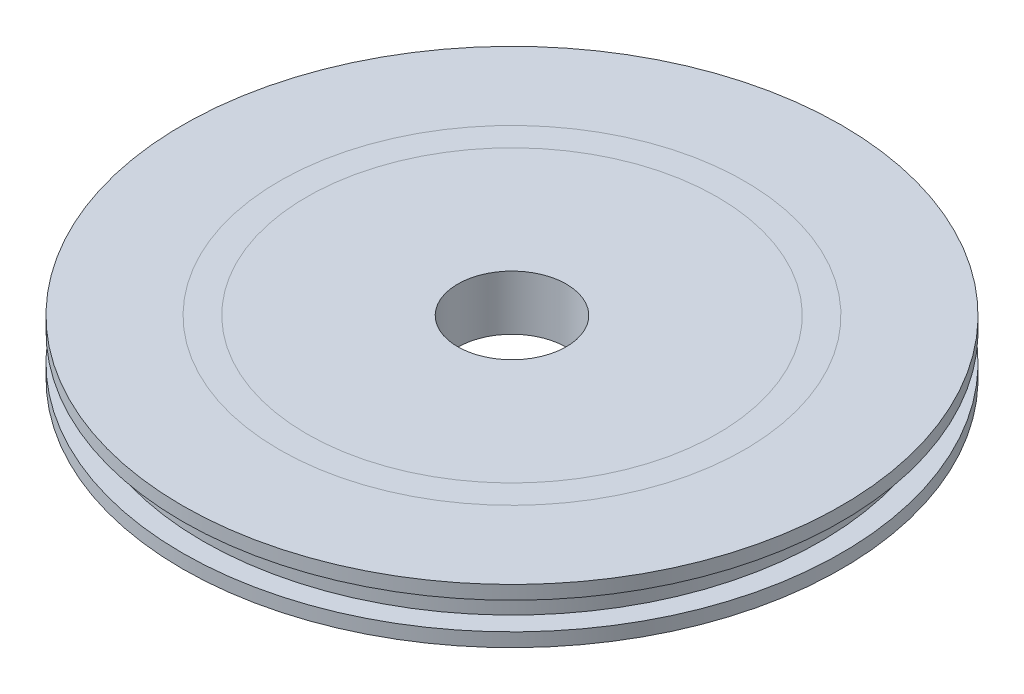
ISO-10303-21;
HEADER;
FILE_DESCRIPTION(('STEP AP214'),'2;1');
FILE_NAME('part.step','',(''),(''),'','','');
FILE_SCHEMA(('AUTOMOTIVE_DESIGN { 1 0 10303 214 1 1 1 1 }'));
ENDSEC;
DATA;
#1=APPLICATION_CONTEXT('core data for automotive mechanical design processes');
#2=APPLICATION_PROTOCOL_DEFINITION('international standard','automotive_design',2000,#1);
#3=PRODUCT_CONTEXT('',#1,'mechanical');
#4=PRODUCT('Part','Part','',(#3));
#5=PRODUCT_RELATED_PRODUCT_CATEGORY('part','',(#4));
#6=PRODUCT_DEFINITION_FORMATION('','',#4);
#7=PRODUCT_DEFINITION_CONTEXT('part definition',#1,'design');
#8=PRODUCT_DEFINITION('design','',#6,#7);
#9=PRODUCT_DEFINITION_SHAPE('','',#8);
#10=(LENGTH_UNIT() NAMED_UNIT(*) SI_UNIT(.MILLI.,.METRE.));
#11=(NAMED_UNIT(*) PLANE_ANGLE_UNIT() SI_UNIT($,.RADIAN.));
#12=(NAMED_UNIT(*) SI_UNIT($,.STERADIAN.) SOLID_ANGLE_UNIT());
#13=UNCERTAINTY_MEASURE_WITH_UNIT(LENGTH_MEASURE(1.E-05),#10,'distance_accuracy_value','');
#14=(GEOMETRIC_REPRESENTATION_CONTEXT(3) GLOBAL_UNCERTAINTY_ASSIGNED_CONTEXT((#13)) GLOBAL_UNIT_ASSIGNED_CONTEXT((#10,
#11,#12)) REPRESENTATION_CONTEXT('',''));
#15=CARTESIAN_POINT('',(0.,0.,0.));
#16=DIRECTION('',(0.,0.,1.));
#17=DIRECTION('',(1.,0.,0.));
#18=AXIS2_PLACEMENT_3D('',#15,#16,#17);
#19=CARTESIAN_POINT('',(0.,0.,30.58668));
#20=DIRECTION('',(0.,1.,0.));
#21=DIRECTION('',(0.,0.,1.));
#22=AXIS2_PLACEMENT_3D('',#19,#20,#21);
#23=PLANE('',#22);
#24=CARTESIAN_POINT('',(0.,0.,0.));
#25=DIRECTION('',(0.,1.,0.));
#26=DIRECTION('',(0.,0.,1.));
#27=AXIS2_PLACEMENT_3D('',#24,#25,#26);
#28=CIRCLE('',#27,30.58668);
#29=CARTESIAN_POINT('',(0.,0.,30.58668));
#30=VERTEX_POINT('',#29);
#31=EDGE_CURVE('E74',#30,#30,#28,.T.);
#32=ORIENTED_EDGE('',*,*,#31,.T.);
#33=EDGE_LOOP('',(#32));
#34=FACE_BOUND('',#33,.T.);
#35=CARTESIAN_POINT('',(0.,0.,0.));
#36=DIRECTION('',(0.,1.,0.));
#37=DIRECTION('',(0.,0.,1.));
#38=AXIS2_PLACEMENT_3D('',#35,#36,#37);
#39=CIRCLE('',#38,21.59);
#40=CARTESIAN_POINT('',(0.,0.,21.59));
#41=VERTEX_POINT('',#40);
#42=EDGE_CURVE('E10',#41,#41,#39,.F.);
#43=ORIENTED_EDGE('',*,*,#42,.T.);
#44=EDGE_LOOP('',(#43));
#45=FACE_BOUND('',#44,.T.);
#46=ADVANCED_FACE('F39',(#34,#45),#23,.T.);
#47=ORIENTED_EDGE('',*,*,#42,.F.);
#48=EDGE_LOOP('',(#47));
#49=FACE_BOUND('',#48,.T.);
#50=CARTESIAN_POINT('',(0.,0.,0.));
#51=DIRECTION('',(0.,1.,0.));
#52=DIRECTION('',(0.,0.,1.));
#53=AXIS2_PLACEMENT_3D('',#50,#51,#52);
#54=CIRCLE('',#53,19.05);
#55=CARTESIAN_POINT('',(0.,0.,19.05));
#56=VERTEX_POINT('',#55);
#57=EDGE_CURVE('E47',#56,#56,#54,.F.);
#58=ORIENTED_EDGE('',*,*,#57,.T.);
#59=EDGE_LOOP('',(#58));
#60=FACE_BOUND('',#59,.T.);
#61=ADVANCED_FACE('F128',(#49,#60),#23,.T.);
#62=CARTESIAN_POINT('',(0.,0.,0.));
#63=DIRECTION('',(0.,-1.,0.));
#64=DIRECTION('',(0.,0.,-1.));
#65=AXIS2_PLACEMENT_3D('',#62,#63,#64);
#66=CIRCLE('',#65,5.0419);
#67=CARTESIAN_POINT('',(0.,0.,-5.0419));
#68=VERTEX_POINT('',#67);
#69=EDGE_CURVE('E77',#68,#68,#66,.T.);
#70=ORIENTED_EDGE('',*,*,#69,.T.);
#71=EDGE_LOOP('',(#70));
#72=FACE_BOUND('',#71,.T.);
#73=ORIENTED_EDGE('',*,*,#57,.F.);
#74=EDGE_LOOP('',(#73));
#75=FACE_BOUND('',#74,.T.);
#76=ADVANCED_FACE('F41',(#72,#75),#23,.T.);
#77=CARTESIAN_POINT('',(0.,-5.08,0.));
#78=DIRECTION('',(0.,-1.,0.));
#79=DIRECTION('',(0.,0.,-1.));
#80=AXIS2_PLACEMENT_3D('',#77,#78,#79);
#81=PLANE('',#80);
#82=CARTESIAN_POINT('',(0.,-5.08,0.));
#83=DIRECTION('',(0.,-1.,0.));
#84=DIRECTION('',(0.,0.,-1.));
#85=AXIS2_PLACEMENT_3D('',#82,#83,#84);
#86=CIRCLE('',#85,5.0419);
#87=CARTESIAN_POINT('',(0.,-5.08,-5.0419));
#88=VERTEX_POINT('',#87);
#89=EDGE_CURVE('E78',#88,#88,#86,.T.);
#90=ORIENTED_EDGE('',*,*,#89,.F.);
#91=EDGE_LOOP('',(#90));
#92=FACE_BOUND('',#91,.T.);
#93=CARTESIAN_POINT('',(0.,-5.08,0.));
#94=DIRECTION('',(0.,1.,0.));
#95=DIRECTION('',(0.,0.,1.));
#96=AXIS2_PLACEMENT_3D('',#93,#94,#95);
#97=CIRCLE('',#96,30.58668);
#98=CARTESIAN_POINT('',(0.,-5.08,30.58668));
#99=VERTEX_POINT('',#98);
#100=EDGE_CURVE('E54',#99,#99,#97,.T.);
#101=ORIENTED_EDGE('',*,*,#100,.F.);
#102=EDGE_LOOP('',(#101));
#103=FACE_BOUND('',#102,.T.);
#104=ADVANCED_FACE('F93',(#92,#103),#81,.T.);
#105=CARTESIAN_POINT('',(0.,0.,0.));
#106=DIRECTION('',(0.,1.,0.));
#107=DIRECTION('',(0.,0.,1.));
#108=AXIS2_PLACEMENT_3D('',#105,#106,#107);
#109=CYLINDRICAL_SURFACE('',#108,30.58668);
#110=ORIENTED_EDGE('',*,*,#100,.T.);
#111=EDGE_LOOP('',(#110));
#112=FACE_BOUND('',#111,.T.);
#113=CARTESIAN_POINT('',(0.,-3.81,0.));
#114=DIRECTION('',(0.,1.,0.));
#115=DIRECTION('',(0.,0.,1.));
#116=AXIS2_PLACEMENT_3D('',#113,#114,#115);
#117=CIRCLE('',#116,30.58668);
#118=CARTESIAN_POINT('',(0.,-3.81,30.58668));
#119=VERTEX_POINT('',#118);
#120=EDGE_CURVE('E60',#119,#119,#117,.T.);
#121=ORIENTED_EDGE('',*,*,#120,.F.);
#122=EDGE_LOOP('',(#121));
#123=FACE_BOUND('',#122,.T.);
#124=ADVANCED_FACE('F96',(#112,#123),#109,.T.);
#125=CARTESIAN_POINT('',(0.,-3.81,30.58668));
#126=DIRECTION('',(0.,1.,0.));
#127=DIRECTION('',(0.,0.,1.));
#128=AXIS2_PLACEMENT_3D('',#125,#126,#127);
#129=PLANE('',#128);
#130=ORIENTED_EDGE('',*,*,#120,.T.);
#131=EDGE_LOOP('',(#130));
#132=FACE_BOUND('',#131,.T.);
#133=CARTESIAN_POINT('',(0.,-3.81,0.));
#134=DIRECTION('',(0.,1.,0.));
#135=DIRECTION('',(0.,0.,1.));
#136=AXIS2_PLACEMENT_3D('',#133,#134,#135);
#137=CIRCLE('',#136,28.68168);
#138=CARTESIAN_POINT('',(0.,-3.81,28.68168));
#139=VERTEX_POINT('',#138);
#140=EDGE_CURVE('E65',#139,#139,#137,.T.);
#141=ORIENTED_EDGE('',*,*,#140,.F.);
#142=EDGE_LOOP('',(#141));
#143=FACE_BOUND('',#142,.T.);
#144=ADVANCED_FACE('F101',(#132,#143),#129,.T.);
#145=CARTESIAN_POINT('',(0.,0.,0.));
#146=DIRECTION('',(0.,1.,0.));
#147=DIRECTION('',(0.,0.,1.));
#148=AXIS2_PLACEMENT_3D('',#145,#146,#147);
#149=CYLINDRICAL_SURFACE('',#148,28.68168);
#150=ORIENTED_EDGE('',*,*,#140,.T.);
#151=EDGE_LOOP('',(#150));
#152=FACE_BOUND('',#151,.T.);
#153=CARTESIAN_POINT('',(0.,-1.27,0.));
#154=DIRECTION('',(0.,1.,0.));
#155=DIRECTION('',(0.,0.,1.));
#156=AXIS2_PLACEMENT_3D('',#153,#154,#155);
#157=CIRCLE('',#156,28.68168);
#158=CARTESIAN_POINT('',(0.,-1.27,28.68168));
#159=VERTEX_POINT('',#158);
#160=EDGE_CURVE('E68',#159,#159,#157,.T.);
#161=ORIENTED_EDGE('',*,*,#160,.F.);
#162=EDGE_LOOP('',(#161));
#163=FACE_BOUND('',#162,.T.);
#164=ADVANCED_FACE('F107',(#152,#163),#149,.T.);
#165=CARTESIAN_POINT('',(0.,-1.27,28.68168));
#166=DIRECTION('',(0.,-1.,0.));
#167=DIRECTION('',(0.,0.,-1.));
#168=AXIS2_PLACEMENT_3D('',#165,#166,#167);
#169=PLANE('',#168);
#170=ORIENTED_EDGE('',*,*,#160,.T.);
#171=EDGE_LOOP('',(#170));
#172=FACE_BOUND('',#171,.T.);
#173=CARTESIAN_POINT('',(0.,-1.27,0.));
#174=DIRECTION('',(0.,1.,0.));
#175=DIRECTION('',(0.,0.,1.));
#176=AXIS2_PLACEMENT_3D('',#173,#174,#175);
#177=CIRCLE('',#176,30.58668);
#178=CARTESIAN_POINT('',(0.,-1.27,30.58668));
#179=VERTEX_POINT('',#178);
#180=EDGE_CURVE('E71',#179,#179,#177,.T.);
#181=ORIENTED_EDGE('',*,*,#180,.F.);
#182=EDGE_LOOP('',(#181));
#183=FACE_BOUND('',#182,.T.);
#184=ADVANCED_FACE('F113',(#172,#183),#169,.T.);
#185=CARTESIAN_POINT('',(0.,0.,0.));
#186=DIRECTION('',(0.,1.,0.));
#187=DIRECTION('',(0.,0.,1.));
#188=AXIS2_PLACEMENT_3D('',#185,#186,#187);
#189=CYLINDRICAL_SURFACE('',#188,30.58668);
#190=ORIENTED_EDGE('',*,*,#180,.T.);
#191=EDGE_LOOP('',(#190));
#192=FACE_BOUND('',#191,.T.);
#193=ORIENTED_EDGE('',*,*,#31,.F.);
#194=EDGE_LOOP('',(#193));
#195=FACE_BOUND('',#194,.T.);
#196=ADVANCED_FACE('F89',(#192,#195),#189,.T.);
#197=CARTESIAN_POINT('',(0.,0.,0.));
#198=DIRECTION('',(0.,-1.,0.));
#199=DIRECTION('',(0.,0.,-1.));
#200=AXIS2_PLACEMENT_3D('',#197,#198,#199);
#201=CYLINDRICAL_SURFACE('',#200,5.0419);
#202=ORIENTED_EDGE('',*,*,#69,.F.);
#203=EDGE_LOOP('',(#202));
#204=FACE_BOUND('',#203,.T.);
#205=ORIENTED_EDGE('',*,*,#89,.T.);
#206=EDGE_LOOP('',(#205));
#207=FACE_BOUND('',#206,.T.);
#208=ADVANCED_FACE('F86',(#204,#207),#201,.F.);
#209=CLOSED_SHELL('',(#46,#61,#76,#104,#124,#144,#164,#184,#196,#208));
#210=MANIFOLD_SOLID_BREP('B2',#209);
#211=ADVANCED_BREP_SHAPE_REPRESENTATION('',(#18,#210),#14);
#212=SHAPE_DEFINITION_REPRESENTATION(#9,#211);
ENDSEC;
END-ISO-10303-21;
